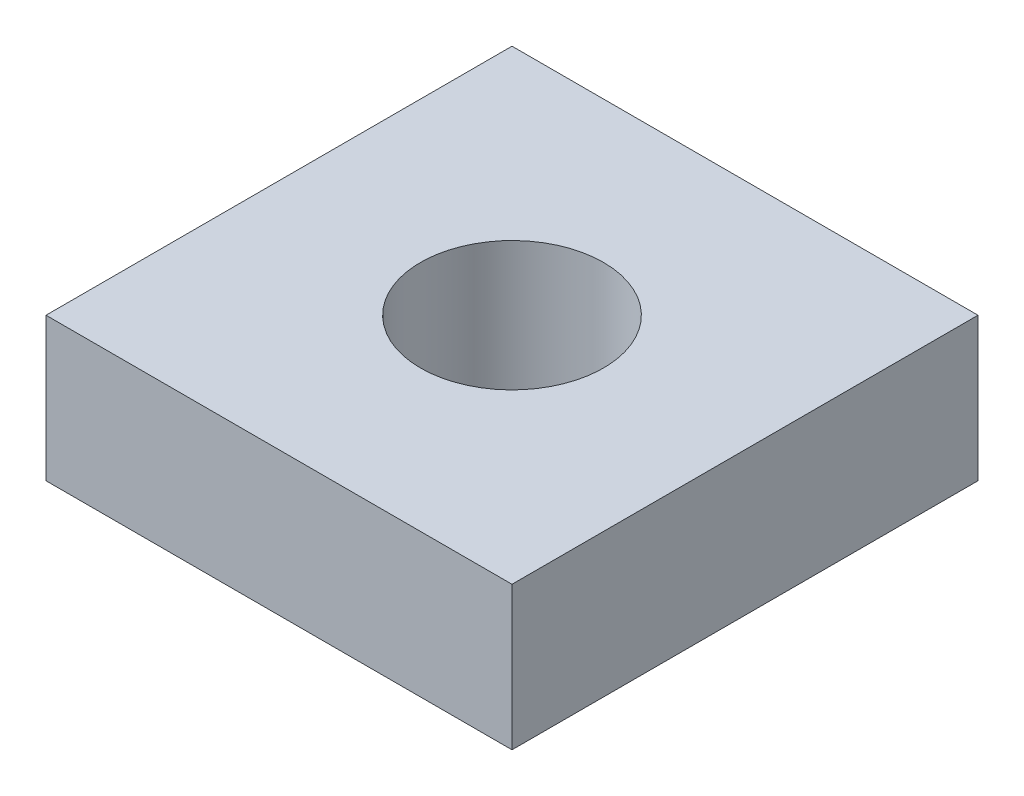
ISO-10303-21;
HEADER;
FILE_DESCRIPTION(('STEP AP214'),'2;1');
FILE_NAME('part.step','',(''),(''),'','','');
FILE_SCHEMA(('AUTOMOTIVE_DESIGN { 1 0 10303 214 1 1 1 1 }'));
ENDSEC;
DATA;
#1=APPLICATION_CONTEXT('core data for automotive mechanical design processes');
#2=APPLICATION_PROTOCOL_DEFINITION('international standard','automotive_design',2000,#1);
#3=PRODUCT_CONTEXT('',#1,'mechanical');
#4=PRODUCT('Part','Part','',(#3));
#5=PRODUCT_RELATED_PRODUCT_CATEGORY('part','',(#4));
#6=PRODUCT_DEFINITION_FORMATION('','',#4);
#7=PRODUCT_DEFINITION_CONTEXT('part definition',#1,'design');
#8=PRODUCT_DEFINITION('design','',#6,#7);
#9=PRODUCT_DEFINITION_SHAPE('','',#8);
#10=(LENGTH_UNIT() NAMED_UNIT(*) SI_UNIT(.MILLI.,.METRE.));
#11=(NAMED_UNIT(*) PLANE_ANGLE_UNIT() SI_UNIT($,.RADIAN.));
#12=(NAMED_UNIT(*) SI_UNIT($,.STERADIAN.) SOLID_ANGLE_UNIT());
#13=UNCERTAINTY_MEASURE_WITH_UNIT(LENGTH_MEASURE(1.E-05),#10,'distance_accuracy_value','');
#14=(GEOMETRIC_REPRESENTATION_CONTEXT(3) GLOBAL_UNCERTAINTY_ASSIGNED_CONTEXT((#13)) GLOBAL_UNIT_ASSIGNED_CONTEXT((#10,
#11,#12)) REPRESENTATION_CONTEXT('',''));
#15=CARTESIAN_POINT('',(0.,0.,0.));
#16=DIRECTION('',(0.,0.,1.));
#17=DIRECTION('',(1.,0.,0.));
#18=AXIS2_PLACEMENT_3D('',#15,#16,#17);
#19=CARTESIAN_POINT('',(0.,0.,13.));
#20=DIRECTION('',(1.,0.,0.));
#21=DIRECTION('',(0.,0.,-1.));
#22=AXIS2_PLACEMENT_3D('',#19,#20,#21);
#23=PLANE('',#22);
#24=DIRECTION('',(0.,-1.,0.));
#25=VECTOR('',#24,1.);
#26=CARTESIAN_POINT('',(0.,0.,0.));
#27=LINE('',#26,#25);
#28=CARTESIAN_POINT('',(0.,4.,0.));
#29=VERTEX_POINT('',#28);
#30=CARTESIAN_POINT('',(0.,0.,0.));
#31=VERTEX_POINT('',#30);
#32=EDGE_CURVE('E127',#29,#31,#27,.T.);
#33=ORIENTED_EDGE('',*,*,#32,.T.);
#34=DIRECTION('',(0.,0.,-1.));
#35=VECTOR('',#34,1.);
#36=CARTESIAN_POINT('',(0.,0.,13.));
#37=LINE('',#36,#35);
#38=CARTESIAN_POINT('',(0.,0.,13.));
#39=VERTEX_POINT('',#38);
#40=EDGE_CURVE('E13',#39,#31,#37,.T.);
#41=ORIENTED_EDGE('',*,*,#40,.F.);
#42=DIRECTION('',(0.,-1.,0.));
#43=VECTOR('',#42,1.);
#44=CARTESIAN_POINT('',(0.,0.,13.));
#45=LINE('',#44,#43);
#46=CARTESIAN_POINT('',(0.,4.,13.));
#47=VERTEX_POINT('',#46);
#48=EDGE_CURVE('E111',#47,#39,#45,.T.);
#49=ORIENTED_EDGE('',*,*,#48,.F.);
#50=DIRECTION('',(0.,0.,-1.));
#51=VECTOR('',#50,1.);
#52=CARTESIAN_POINT('',(0.,4.,13.));
#53=LINE('',#52,#51);
#54=EDGE_CURVE('E123',#47,#29,#53,.T.);
#55=ORIENTED_EDGE('',*,*,#54,.T.);
#56=EDGE_LOOP('',(#33,#41,#49,#55));
#57=FACE_BOUND('',#56,.T.);
#58=ADVANCED_FACE('F59',(#57),#23,.F.);
#59=CARTESIAN_POINT('',(0.,0.,13.));
#60=DIRECTION('',(0.,1.,0.));
#61=DIRECTION('',(0.,0.,1.));
#62=AXIS2_PLACEMENT_3D('',#59,#60,#61);
#63=PLANE('',#62);
#64=CARTESIAN_POINT('',(6.5,0.,6.5));
#65=DIRECTION('',(0.,1.,0.));
#66=DIRECTION('',(0.,0.,1.));
#67=AXIS2_PLACEMENT_3D('',#64,#65,#66);
#68=CIRCLE('',#67,2.5527);
#69=CARTESIAN_POINT('',(6.5,0.,9.0527));
#70=VERTEX_POINT('',#69);
#71=EDGE_CURVE('E131',#70,#70,#68,.T.);
#72=ORIENTED_EDGE('',*,*,#71,.T.);
#73=EDGE_LOOP('',(#72));
#74=FACE_BOUND('',#73,.T.);
#75=DIRECTION('',(1.,0.,0.));
#76=VECTOR('',#75,1.);
#77=CARTESIAN_POINT('',(0.,0.,0.));
#78=LINE('',#77,#76);
#79=CARTESIAN_POINT('',(13.,0.,0.));
#80=VERTEX_POINT('',#79);
#81=EDGE_CURVE('E116',#31,#80,#78,.T.);
#82=ORIENTED_EDGE('',*,*,#81,.T.);
#83=DIRECTION('',(0.,0.,-1.));
#84=VECTOR('',#83,1.);
#85=CARTESIAN_POINT('',(13.,0.,13.));
#86=LINE('',#85,#84);
#87=CARTESIAN_POINT('',(13.,0.,13.));
#88=VERTEX_POINT('',#87);
#89=EDGE_CURVE('E68',#88,#80,#86,.T.);
#90=ORIENTED_EDGE('',*,*,#89,.F.);
#91=DIRECTION('',(1.,0.,0.));
#92=VECTOR('',#91,1.);
#93=CARTESIAN_POINT('',(0.,0.,13.));
#94=LINE('',#93,#92);
#95=EDGE_CURVE('E106',#39,#88,#94,.T.);
#96=ORIENTED_EDGE('',*,*,#95,.F.);
#97=ORIENTED_EDGE('',*,*,#40,.T.);
#98=EDGE_LOOP('',(#82,#90,#96,#97));
#99=FACE_BOUND('',#98,.T.);
#100=ADVANCED_FACE('F115',(#74,#99),#63,.F.);
#101=CARTESIAN_POINT('',(13.,0.,13.));
#102=DIRECTION('',(-1.,0.,0.));
#103=DIRECTION('',(0.,0.,1.));
#104=AXIS2_PLACEMENT_3D('',#101,#102,#103);
#105=PLANE('',#104);
#106=DIRECTION('',(0.,1.,0.));
#107=VECTOR('',#106,1.);
#108=CARTESIAN_POINT('',(13.,0.,0.));
#109=LINE('',#108,#107);
#110=CARTESIAN_POINT('',(13.,4.,0.));
#111=VERTEX_POINT('',#110);
#112=EDGE_CURVE('E93',#80,#111,#109,.T.);
#113=ORIENTED_EDGE('',*,*,#112,.T.);
#114=DIRECTION('',(0.,0.,-1.));
#115=VECTOR('',#114,1.);
#116=CARTESIAN_POINT('',(13.,4.,13.));
#117=LINE('',#116,#115);
#118=CARTESIAN_POINT('',(13.,4.,13.));
#119=VERTEX_POINT('',#118);
#120=EDGE_CURVE('E118',#119,#111,#117,.T.);
#121=ORIENTED_EDGE('',*,*,#120,.F.);
#122=DIRECTION('',(0.,1.,0.));
#123=VECTOR('',#122,1.);
#124=CARTESIAN_POINT('',(13.,0.,13.));
#125=LINE('',#124,#123);
#126=EDGE_CURVE('E109',#88,#119,#125,.T.);
#127=ORIENTED_EDGE('',*,*,#126,.F.);
#128=ORIENTED_EDGE('',*,*,#89,.T.);
#129=EDGE_LOOP('',(#113,#121,#127,#128));
#130=FACE_BOUND('',#129,.T.);
#131=ADVANCED_FACE('F119',(#130),#105,.F.);
#132=CARTESIAN_POINT('',(0.,4.,13.));
#133=DIRECTION('',(0.,-1.,0.));
#134=DIRECTION('',(0.,0.,-1.));
#135=AXIS2_PLACEMENT_3D('',#132,#133,#134);
#136=PLANE('',#135);
#137=CARTESIAN_POINT('',(6.5,4.,6.5));
#138=DIRECTION('',(0.,1.,0.));
#139=DIRECTION('',(0.,0.,1.));
#140=AXIS2_PLACEMENT_3D('',#137,#138,#139);
#141=CIRCLE('',#140,2.5527);
#142=CARTESIAN_POINT('',(6.5,4.,9.0527));
#143=VERTEX_POINT('',#142);
#144=EDGE_CURVE('E151',#143,#143,#141,.T.);
#145=ORIENTED_EDGE('',*,*,#144,.F.);
#146=EDGE_LOOP('',(#145));
#147=FACE_BOUND('',#146,.T.);
#148=DIRECTION('',(-1.,0.,0.));
#149=VECTOR('',#148,1.);
#150=CARTESIAN_POINT('',(0.,4.,0.));
#151=LINE('',#150,#149);
#152=EDGE_CURVE('E99',#111,#29,#151,.T.);
#153=ORIENTED_EDGE('',*,*,#152,.T.);
#154=ORIENTED_EDGE('',*,*,#54,.F.);
#155=DIRECTION('',(-1.,0.,0.));
#156=VECTOR('',#155,1.);
#157=CARTESIAN_POINT('',(0.,4.,13.));
#158=LINE('',#157,#156);
#159=EDGE_CURVE('E76',#119,#47,#158,.T.);
#160=ORIENTED_EDGE('',*,*,#159,.F.);
#161=ORIENTED_EDGE('',*,*,#120,.T.);
#162=EDGE_LOOP('',(#153,#154,#160,#161));
#163=FACE_BOUND('',#162,.T.);
#164=ADVANCED_FACE('F141',(#147,#163),#136,.F.);
#165=CARTESIAN_POINT('',(0.,0.,13.));
#166=DIRECTION('',(0.,0.,-1.));
#167=DIRECTION('',(-1.,0.,0.));
#168=AXIS2_PLACEMENT_3D('',#165,#166,#167);
#169=PLANE('',#168);
#170=ORIENTED_EDGE('',*,*,#48,.T.);
#171=ORIENTED_EDGE('',*,*,#95,.T.);
#172=ORIENTED_EDGE('',*,*,#126,.T.);
#173=ORIENTED_EDGE('',*,*,#159,.T.);
#174=EDGE_LOOP('',(#170,#171,#172,#173));
#175=FACE_BOUND('',#174,.T.);
#176=ADVANCED_FACE('F107',(#175),#169,.F.);
#177=CARTESIAN_POINT('',(0.,0.,0.));
#178=DIRECTION('',(0.,0.,-1.));
#179=DIRECTION('',(-1.,0.,0.));
#180=AXIS2_PLACEMENT_3D('',#177,#178,#179);
#181=PLANE('',#180);
#182=ORIENTED_EDGE('',*,*,#32,.F.);
#183=ORIENTED_EDGE('',*,*,#152,.F.);
#184=ORIENTED_EDGE('',*,*,#112,.F.);
#185=ORIENTED_EDGE('',*,*,#81,.F.);
#186=EDGE_LOOP('',(#182,#183,#184,#185));
#187=FACE_BOUND('',#186,.T.);
#188=ADVANCED_FACE('F144',(#187),#181,.T.);
#189=CARTESIAN_POINT('',(6.5,4.,6.5));
#190=DIRECTION('',(0.,1.,0.));
#191=DIRECTION('',(0.,0.,1.));
#192=AXIS2_PLACEMENT_3D('',#189,#190,#191);
#193=CYLINDRICAL_SURFACE('',#192,2.5527);
#194=ORIENTED_EDGE('',*,*,#71,.F.);
#195=EDGE_LOOP('',(#194));
#196=FACE_BOUND('',#195,.T.);
#197=ORIENTED_EDGE('',*,*,#144,.T.);
#198=EDGE_LOOP('',(#197));
#199=FACE_BOUND('',#198,.T.);
#200=ADVANCED_FACE('F156',(#196,#199),#193,.F.);
#201=CLOSED_SHELL('',(#58,#100,#131,#164,#176,#188,#200));
#202=MANIFOLD_SOLID_BREP('B2',#201);
#203=ADVANCED_BREP_SHAPE_REPRESENTATION('',(#18,#202),#14);
#204=SHAPE_DEFINITION_REPRESENTATION(#9,#203);
ENDSEC;
END-ISO-10303-21;
